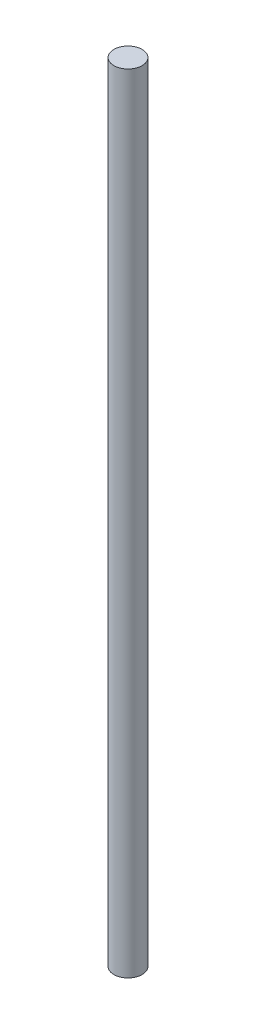
ISO-10303-21;
HEADER;
FILE_DESCRIPTION(('STEP AP214'),'2;1');
FILE_NAME('part.step','',(''),(''),'','','');
FILE_SCHEMA(('AUTOMOTIVE_DESIGN { 1 0 10303 214 1 1 1 1 }'));
ENDSEC;
DATA;
#1=APPLICATION_CONTEXT('core data for automotive mechanical design processes');
#2=APPLICATION_PROTOCOL_DEFINITION('international standard','automotive_design',2000,#1);
#3=PRODUCT_CONTEXT('',#1,'mechanical');
#4=PRODUCT('Part','Part','',(#3));
#5=PRODUCT_RELATED_PRODUCT_CATEGORY('part','',(#4));
#6=PRODUCT_DEFINITION_FORMATION('','',#4);
#7=PRODUCT_DEFINITION_CONTEXT('part definition',#1,'design');
#8=PRODUCT_DEFINITION('design','',#6,#7);
#9=PRODUCT_DEFINITION_SHAPE('','',#8);
#10=(LENGTH_UNIT() NAMED_UNIT(*) SI_UNIT(.MILLI.,.METRE.));
#11=(NAMED_UNIT(*) PLANE_ANGLE_UNIT() SI_UNIT($,.RADIAN.));
#12=(NAMED_UNIT(*) SI_UNIT($,.STERADIAN.) SOLID_ANGLE_UNIT());
#13=UNCERTAINTY_MEASURE_WITH_UNIT(LENGTH_MEASURE(1.E-05),#10,'distance_accuracy_value','');
#14=(GEOMETRIC_REPRESENTATION_CONTEXT(3) GLOBAL_UNCERTAINTY_ASSIGNED_CONTEXT((#13)) GLOBAL_UNIT_ASSIGNED_CONTEXT((#10,
#11,#12)) REPRESENTATION_CONTEXT('',''));
#15=CARTESIAN_POINT('',(0.,0.,0.));
#16=DIRECTION('',(0.,0.,1.));
#17=DIRECTION('',(1.,0.,0.));
#18=AXIS2_PLACEMENT_3D('',#15,#16,#17);
#19=CARTESIAN_POINT('',(0.,335.,0.));
#20=DIRECTION('',(0.,-1.,0.));
#21=DIRECTION('',(0.,0.,-1.));
#22=AXIS2_PLACEMENT_3D('',#19,#20,#21);
#23=CYLINDRICAL_SURFACE('',#22,6.);
#24=CARTESIAN_POINT('',(0.,335.,0.));
#25=DIRECTION('',(0.,1.,0.));
#26=DIRECTION('',(0.,0.,1.));
#27=AXIS2_PLACEMENT_3D('',#24,#25,#26);
#28=CIRCLE('',#27,6.);
#29=CARTESIAN_POINT('',(0.,335.,6.));
#30=VERTEX_POINT('',#29);
#31=EDGE_CURVE('E10',#30,#30,#28,.T.);
#32=ORIENTED_EDGE('',*,*,#31,.F.);
#33=EDGE_LOOP('',(#32));
#34=FACE_BOUND('',#33,.T.);
#35=CARTESIAN_POINT('',(0.,0.,0.));
#36=DIRECTION('',(0.,1.,0.));
#37=DIRECTION('',(0.,0.,1.));
#38=AXIS2_PLACEMENT_3D('',#35,#36,#37);
#39=CIRCLE('',#38,6.);
#40=CARTESIAN_POINT('',(0.,0.,6.));
#41=VERTEX_POINT('',#40);
#42=EDGE_CURVE('E36',#41,#41,#39,.T.);
#43=ORIENTED_EDGE('',*,*,#42,.T.);
#44=EDGE_LOOP('',(#43));
#45=FACE_BOUND('',#44,.T.);
#46=ADVANCED_FACE('F33',(#34,#45),#23,.T.);
#47=CARTESIAN_POINT('',(0.,335.,0.));
#48=DIRECTION('',(0.,1.,0.));
#49=DIRECTION('',(0.,0.,1.));
#50=AXIS2_PLACEMENT_3D('',#47,#48,#49);
#51=PLANE('',#50);
#52=ORIENTED_EDGE('',*,*,#31,.T.);
#53=EDGE_LOOP('',(#52));
#54=FACE_BOUND('',#53,.T.);
#55=ADVANCED_FACE('F48',(#54),#51,.T.);
#56=CARTESIAN_POINT('',(0.,0.,0.));
#57=DIRECTION('',(0.,1.,0.));
#58=DIRECTION('',(0.,0.,1.));
#59=AXIS2_PLACEMENT_3D('',#56,#57,#58);
#60=PLANE('',#59);
#61=ORIENTED_EDGE('',*,*,#42,.F.);
#62=EDGE_LOOP('',(#61));
#63=FACE_BOUND('',#62,.T.);
#64=ADVANCED_FACE('F46',(#63),#60,.F.);
#65=CLOSED_SHELL('',(#46,#55,#64));
#66=MANIFOLD_SOLID_BREP('B2',#65);
#67=ADVANCED_BREP_SHAPE_REPRESENTATION('',(#18,#66),#14);
#68=SHAPE_DEFINITION_REPRESENTATION(#9,#67);
ENDSEC;
END-ISO-10303-21;
